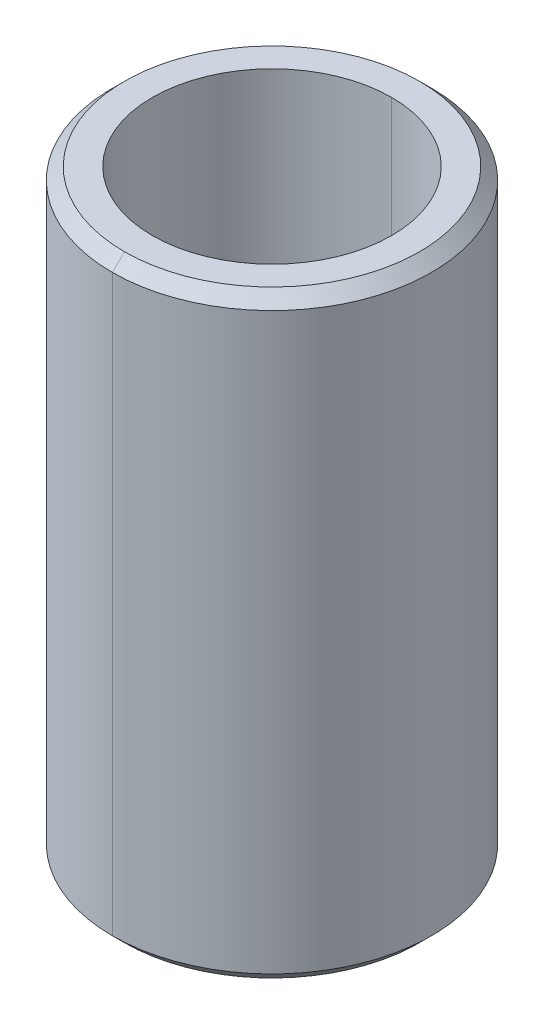
ISO-10303-21;
HEADER;
FILE_DESCRIPTION(('STEP AP214'),'2;1');
FILE_NAME('part.step','',(''),(''),'','','');
FILE_SCHEMA(('AUTOMOTIVE_DESIGN { 1 0 10303 214 1 1 1 1 }'));
ENDSEC;
DATA;
#1=APPLICATION_CONTEXT('core data for automotive mechanical design processes');
#2=APPLICATION_PROTOCOL_DEFINITION('international standard','automotive_design',2000,#1);
#3=PRODUCT_CONTEXT('',#1,'mechanical');
#4=PRODUCT('Part','Part','',(#3));
#5=PRODUCT_RELATED_PRODUCT_CATEGORY('part','',(#4));
#6=PRODUCT_DEFINITION_FORMATION('','',#4);
#7=PRODUCT_DEFINITION_CONTEXT('part definition',#1,'design');
#8=PRODUCT_DEFINITION('design','',#6,#7);
#9=PRODUCT_DEFINITION_SHAPE('','',#8);
#10=(LENGTH_UNIT() NAMED_UNIT(*) SI_UNIT(.MILLI.,.METRE.));
#11=(NAMED_UNIT(*) PLANE_ANGLE_UNIT() SI_UNIT($,.RADIAN.));
#12=(NAMED_UNIT(*) SI_UNIT($,.STERADIAN.) SOLID_ANGLE_UNIT());
#13=UNCERTAINTY_MEASURE_WITH_UNIT(LENGTH_MEASURE(1.E-05),#10,'distance_accuracy_value','');
#14=(GEOMETRIC_REPRESENTATION_CONTEXT(3) GLOBAL_UNCERTAINTY_ASSIGNED_CONTEXT((#13)) GLOBAL_UNIT_ASSIGNED_CONTEXT((#10,
#11,#12)) REPRESENTATION_CONTEXT('',''));
#15=CARTESIAN_POINT('',(0.,0.,0.));
#16=DIRECTION('',(0.,0.,1.));
#17=DIRECTION('',(1.,0.,0.));
#18=AXIS2_PLACEMENT_3D('',#15,#16,#17);
#19=CARTESIAN_POINT('',(0.,15.,0.));
#20=DIRECTION('',(0.,-1.,0.));
#21=DIRECTION('',(0.,0.,-1.));
#22=AXIS2_PLACEMENT_3D('',#19,#20,#21);
#23=CONICAL_SURFACE('',#22,3.7,0.785398163397447);
#24=DIRECTION('',(0.,-0.707106781186549,0.707106781186546));
#25=VECTOR('',#24,1.);
#26=CARTESIAN_POINT('',(0.,15.,3.7));
#27=LINE('',#26,#25);
#28=CARTESIAN_POINT('',(0.,15.,3.7));
#29=VERTEX_POINT('',#28);
#30=CARTESIAN_POINT('',(0.,14.7,4.));
#31=VERTEX_POINT('',#30);
#32=EDGE_CURVE('E101',#29,#31,#27,.T.);
#33=ORIENTED_EDGE('',*,*,#32,.F.);
#34=CARTESIAN_POINT('',(0.,15.,0.));
#35=DIRECTION('',(0.,1.,0.));
#36=DIRECTION('',(0.,0.,1.));
#37=AXIS2_PLACEMENT_3D('',#34,#35,#36);
#38=CIRCLE('',#37,3.7);
#39=CARTESIAN_POINT('',(0.,15.,-3.7));
#40=VERTEX_POINT('',#39);
#41=EDGE_CURVE('E86',#40,#29,#38,.T.);
#42=ORIENTED_EDGE('',*,*,#41,.F.);
#43=DIRECTION('',(0.,-0.707106781186549,-0.707106781186546));
#44=VECTOR('',#43,1.);
#45=CARTESIAN_POINT('',(0.,15.,-3.7));
#46=LINE('',#45,#44);
#47=CARTESIAN_POINT('',(0.,14.7,-4.));
#48=VERTEX_POINT('',#47);
#49=EDGE_CURVE('E108',#40,#48,#46,.T.);
#50=ORIENTED_EDGE('',*,*,#49,.T.);
#51=CARTESIAN_POINT('',(0.,14.7,0.));
#52=DIRECTION('',(0.,-1.,0.));
#53=DIRECTION('',(0.,0.,1.));
#54=AXIS2_PLACEMENT_3D('',#51,#52,#53);
#55=CIRCLE('',#54,4.);
#56=EDGE_CURVE('E27',#31,#48,#55,.T.);
#57=ORIENTED_EDGE('',*,*,#56,.F.);
#58=EDGE_LOOP('',(#33,#42,#50,#57));
#59=FACE_BOUND('',#58,.T.);
#60=ADVANCED_FACE('F17',(#59),#23,.T.);
#61=CARTESIAN_POINT('',(0.,0.300000000000005,0.));
#62=DIRECTION('',(0.,1.,0.));
#63=DIRECTION('',(0.,0.,1.));
#64=AXIS2_PLACEMENT_3D('',#61,#62,#63);
#65=CONICAL_SURFACE('',#64,4.,0.785398163397447);
#66=DIRECTION('',(0.,0.707106781186549,-0.707106781186547));
#67=VECTOR('',#66,1.);
#68=CARTESIAN_POINT('',(0.,0.300000000000005,-4.));
#69=LINE('',#68,#67);
#70=CARTESIAN_POINT('',(0.,0.,-3.7));
#71=VERTEX_POINT('',#70);
#72=CARTESIAN_POINT('',(0.,0.300000000000005,-4.));
#73=VERTEX_POINT('',#72);
#74=EDGE_CURVE('E133',#71,#73,#69,.T.);
#75=ORIENTED_EDGE('',*,*,#74,.F.);
#76=CARTESIAN_POINT('',(0.,0.,0.));
#77=DIRECTION('',(0.,-1.,0.));
#78=DIRECTION('',(0.,0.,1.));
#79=AXIS2_PLACEMENT_3D('',#76,#77,#78);
#80=CIRCLE('',#79,3.7);
#81=CARTESIAN_POINT('',(0.,0.,3.7));
#82=VERTEX_POINT('',#81);
#83=EDGE_CURVE('E157',#82,#71,#80,.T.);
#84=ORIENTED_EDGE('',*,*,#83,.F.);
#85=DIRECTION('',(0.,0.707106781186549,0.707106781186547));
#86=VECTOR('',#85,1.);
#87=CARTESIAN_POINT('',(0.,0.300000000000005,4.));
#88=LINE('',#87,#86);
#89=CARTESIAN_POINT('',(0.,0.300000000000005,4.));
#90=VERTEX_POINT('',#89);
#91=EDGE_CURVE('E121',#82,#90,#88,.T.);
#92=ORIENTED_EDGE('',*,*,#91,.T.);
#93=CARTESIAN_POINT('',(0.,0.300000000000005,0.));
#94=DIRECTION('',(0.,1.,0.));
#95=DIRECTION('',(0.,0.,1.));
#96=AXIS2_PLACEMENT_3D('',#93,#94,#95);
#97=CIRCLE('',#96,4.);
#98=EDGE_CURVE('E11',#73,#90,#97,.T.);
#99=ORIENTED_EDGE('',*,*,#98,.F.);
#100=EDGE_LOOP('',(#75,#84,#92,#99));
#101=FACE_BOUND('',#100,.T.);
#102=ADVANCED_FACE('F19',(#101),#65,.T.);
#103=CARTESIAN_POINT('',(0.,15.,0.));
#104=DIRECTION('',(0.,-1.,0.));
#105=DIRECTION('',(0.,0.,-1.));
#106=AXIS2_PLACEMENT_3D('',#103,#104,#105);
#107=CYLINDRICAL_SURFACE('',#106,3.);
#108=DIRECTION('',(0.,-1.,0.));
#109=VECTOR('',#108,1.);
#110=CARTESIAN_POINT('',(0.,15.,3.));
#111=LINE('',#110,#109);
#112=CARTESIAN_POINT('',(0.,15.,3.));
#113=VERTEX_POINT('',#112);
#114=CARTESIAN_POINT('',(0.,0.,3.));
#115=VERTEX_POINT('',#114);
#116=EDGE_CURVE('E145',#113,#115,#111,.T.);
#117=ORIENTED_EDGE('',*,*,#116,.F.);
#118=CARTESIAN_POINT('',(0.,15.,0.));
#119=DIRECTION('',(0.,1.,0.));
#120=DIRECTION('',(0.,0.,1.));
#121=AXIS2_PLACEMENT_3D('',#118,#119,#120);
#122=CIRCLE('',#121,3.);
#123=CARTESIAN_POINT('',(0.,15.,-3.));
#124=VERTEX_POINT('',#123);
#125=EDGE_CURVE('E100',#113,#124,#122,.T.);
#126=ORIENTED_EDGE('',*,*,#125,.T.);
#127=DIRECTION('',(0.,-1.,0.));
#128=VECTOR('',#127,1.);
#129=CARTESIAN_POINT('',(0.,15.,-3.));
#130=LINE('',#129,#128);
#131=CARTESIAN_POINT('',(0.,0.,-3.));
#132=VERTEX_POINT('',#131);
#133=EDGE_CURVE('E151',#124,#132,#130,.T.);
#134=ORIENTED_EDGE('',*,*,#133,.T.);
#135=CARTESIAN_POINT('',(0.,0.,0.));
#136=DIRECTION('',(0.,1.,0.));
#137=DIRECTION('',(0.,0.,1.));
#138=AXIS2_PLACEMENT_3D('',#135,#136,#137);
#139=CIRCLE('',#138,3.);
#140=EDGE_CURVE('E36',#115,#132,#139,.T.);
#141=ORIENTED_EDGE('',*,*,#140,.F.);
#142=EDGE_LOOP('',(#117,#126,#134,#141));
#143=FACE_BOUND('',#142,.T.);
#144=ADVANCED_FACE('F189',(#143),#107,.F.);
#145=CARTESIAN_POINT('',(0.,15.,0.));
#146=DIRECTION('',(0.,-1.,0.));
#147=DIRECTION('',(0.,0.,-1.));
#148=AXIS2_PLACEMENT_3D('',#145,#146,#147);
#149=CYLINDRICAL_SURFACE('',#148,4.);
#150=DIRECTION('',(0.,-1.,0.));
#151=VECTOR('',#150,1.);
#152=CARTESIAN_POINT('',(0.,15.,4.));
#153=LINE('',#152,#151);
#154=EDGE_CURVE('E117',#31,#90,#153,.T.);
#155=ORIENTED_EDGE('',*,*,#154,.F.);
#156=ORIENTED_EDGE('',*,*,#56,.T.);
#157=DIRECTION('',(0.,-1.,0.));
#158=VECTOR('',#157,1.);
#159=CARTESIAN_POINT('',(0.,15.,-4.));
#160=LINE('',#159,#158);
#161=EDGE_CURVE('E98',#48,#73,#160,.T.);
#162=ORIENTED_EDGE('',*,*,#161,.T.);
#163=ORIENTED_EDGE('',*,*,#98,.T.);
#164=EDGE_LOOP('',(#155,#156,#162,#163));
#165=FACE_BOUND('',#164,.T.);
#166=ADVANCED_FACE('F169',(#165),#149,.T.);
#167=CARTESIAN_POINT('',(0.,0.,0.));
#168=DIRECTION('',(0.,1.,0.));
#169=DIRECTION('',(1.,0.,0.));
#170=AXIS2_PLACEMENT_3D('',#167,#168,#169);
#171=PLANE('',#170);
#172=CARTESIAN_POINT('',(0.,0.,0.));
#173=DIRECTION('',(0.,1.,0.));
#174=DIRECTION('',(0.,0.,1.));
#175=AXIS2_PLACEMENT_3D('',#172,#173,#174);
#176=CIRCLE('',#175,3.);
#177=EDGE_CURVE('E146',#132,#115,#176,.T.);
#178=ORIENTED_EDGE('',*,*,#177,.T.);
#179=ORIENTED_EDGE('',*,*,#140,.T.);
#180=EDGE_LOOP('',(#178,#179));
#181=FACE_BOUND('',#180,.T.);
#182=ORIENTED_EDGE('',*,*,#83,.T.);
#183=CARTESIAN_POINT('',(0.,0.,0.));
#184=DIRECTION('',(0.,-1.,0.));
#185=DIRECTION('',(0.,0.,1.));
#186=AXIS2_PLACEMENT_3D('',#183,#184,#185);
#187=CIRCLE('',#186,3.7);
#188=EDGE_CURVE('E129',#71,#82,#187,.T.);
#189=ORIENTED_EDGE('',*,*,#188,.T.);
#190=EDGE_LOOP('',(#182,#189));
#191=FACE_BOUND('',#190,.T.);
#192=ADVANCED_FACE('F178',(#181,#191),#171,.F.);
#193=CARTESIAN_POINT('',(0.,15.,0.));
#194=DIRECTION('',(0.,1.,0.));
#195=DIRECTION('',(1.,0.,0.));
#196=AXIS2_PLACEMENT_3D('',#193,#194,#195);
#197=PLANE('',#196);
#198=CARTESIAN_POINT('',(0.,15.,0.));
#199=DIRECTION('',(0.,1.,0.));
#200=DIRECTION('',(0.,0.,1.));
#201=AXIS2_PLACEMENT_3D('',#198,#199,#200);
#202=CIRCLE('',#201,3.);
#203=EDGE_CURVE('E130',#124,#113,#202,.T.);
#204=ORIENTED_EDGE('',*,*,#203,.F.);
#205=ORIENTED_EDGE('',*,*,#125,.F.);
#206=EDGE_LOOP('',(#204,#205));
#207=FACE_BOUND('',#206,.T.);
#208=ORIENTED_EDGE('',*,*,#41,.T.);
#209=CARTESIAN_POINT('',(0.,15.,0.));
#210=DIRECTION('',(0.,1.,0.));
#211=DIRECTION('',(0.,0.,1.));
#212=AXIS2_PLACEMENT_3D('',#209,#210,#211);
#213=CIRCLE('',#212,3.7);
#214=EDGE_CURVE('E95',#29,#40,#213,.T.);
#215=ORIENTED_EDGE('',*,*,#214,.T.);
#216=EDGE_LOOP('',(#208,#215));
#217=FACE_BOUND('',#216,.T.);
#218=ADVANCED_FACE('F89',(#207,#217),#197,.T.);
#219=CARTESIAN_POINT('',(0.,15.,0.));
#220=DIRECTION('',(0.,-1.,0.));
#221=DIRECTION('',(0.,0.,-1.));
#222=AXIS2_PLACEMENT_3D('',#219,#220,#221);
#223=CYLINDRICAL_SURFACE('',#222,4.);
#224=CARTESIAN_POINT('',(0.,14.7,0.));
#225=DIRECTION('',(0.,-1.,0.));
#226=DIRECTION('',(0.,0.,1.));
#227=AXIS2_PLACEMENT_3D('',#224,#225,#226);
#228=CIRCLE('',#227,4.);
#229=EDGE_CURVE('E106',#48,#31,#228,.T.);
#230=ORIENTED_EDGE('',*,*,#229,.T.);
#231=ORIENTED_EDGE('',*,*,#154,.T.);
#232=CARTESIAN_POINT('',(0.,0.300000000000005,0.));
#233=DIRECTION('',(0.,1.,0.));
#234=DIRECTION('',(0.,0.,1.));
#235=AXIS2_PLACEMENT_3D('',#232,#233,#234);
#236=CIRCLE('',#235,4.);
#237=EDGE_CURVE('E126',#90,#73,#236,.T.);
#238=ORIENTED_EDGE('',*,*,#237,.T.);
#239=ORIENTED_EDGE('',*,*,#161,.F.);
#240=EDGE_LOOP('',(#230,#231,#238,#239));
#241=FACE_BOUND('',#240,.T.);
#242=ADVANCED_FACE('F168',(#241),#223,.T.);
#243=CARTESIAN_POINT('',(0.,15.,0.));
#244=DIRECTION('',(0.,-1.,0.));
#245=DIRECTION('',(0.,0.,-1.));
#246=AXIS2_PLACEMENT_3D('',#243,#244,#245);
#247=CYLINDRICAL_SURFACE('',#246,3.);
#248=ORIENTED_EDGE('',*,*,#203,.T.);
#249=ORIENTED_EDGE('',*,*,#116,.T.);
#250=ORIENTED_EDGE('',*,*,#177,.F.);
#251=ORIENTED_EDGE('',*,*,#133,.F.);
#252=EDGE_LOOP('',(#248,#249,#250,#251));
#253=FACE_BOUND('',#252,.T.);
#254=ADVANCED_FACE('F206',(#253),#247,.F.);
#255=CARTESIAN_POINT('',(0.,0.300000000000005,0.));
#256=DIRECTION('',(0.,1.,0.));
#257=DIRECTION('',(0.,0.,1.));
#258=AXIS2_PLACEMENT_3D('',#255,#256,#257);
#259=CONICAL_SURFACE('',#258,4.,0.785398163397447);
#260=ORIENTED_EDGE('',*,*,#188,.F.);
#261=ORIENTED_EDGE('',*,*,#74,.T.);
#262=ORIENTED_EDGE('',*,*,#237,.F.);
#263=ORIENTED_EDGE('',*,*,#91,.F.);
#264=EDGE_LOOP('',(#260,#261,#262,#263));
#265=FACE_BOUND('',#264,.T.);
#266=ADVANCED_FACE('F179',(#265),#259,.T.);
#267=CARTESIAN_POINT('',(0.,15.,0.));
#268=DIRECTION('',(0.,-1.,0.));
#269=DIRECTION('',(0.,0.,-1.));
#270=AXIS2_PLACEMENT_3D('',#267,#268,#269);
#271=CONICAL_SURFACE('',#270,3.7,0.785398163397447);
#272=ORIENTED_EDGE('',*,*,#214,.F.);
#273=ORIENTED_EDGE('',*,*,#32,.T.);
#274=ORIENTED_EDGE('',*,*,#229,.F.);
#275=ORIENTED_EDGE('',*,*,#49,.F.);
#276=EDGE_LOOP('',(#272,#273,#274,#275));
#277=FACE_BOUND('',#276,.T.);
#278=ADVANCED_FACE('F107',(#277),#271,.T.);
#279=CLOSED_SHELL('',(#60,#102,#144,#166,#192,#218,#242,#254,#266,#278));
#280=MANIFOLD_SOLID_BREP('B1',#279);
#281=ADVANCED_BREP_SHAPE_REPRESENTATION('',(#18,#280),#14);
#282=SHAPE_DEFINITION_REPRESENTATION(#9,#281);
ENDSEC;
END-ISO-10303-21;
